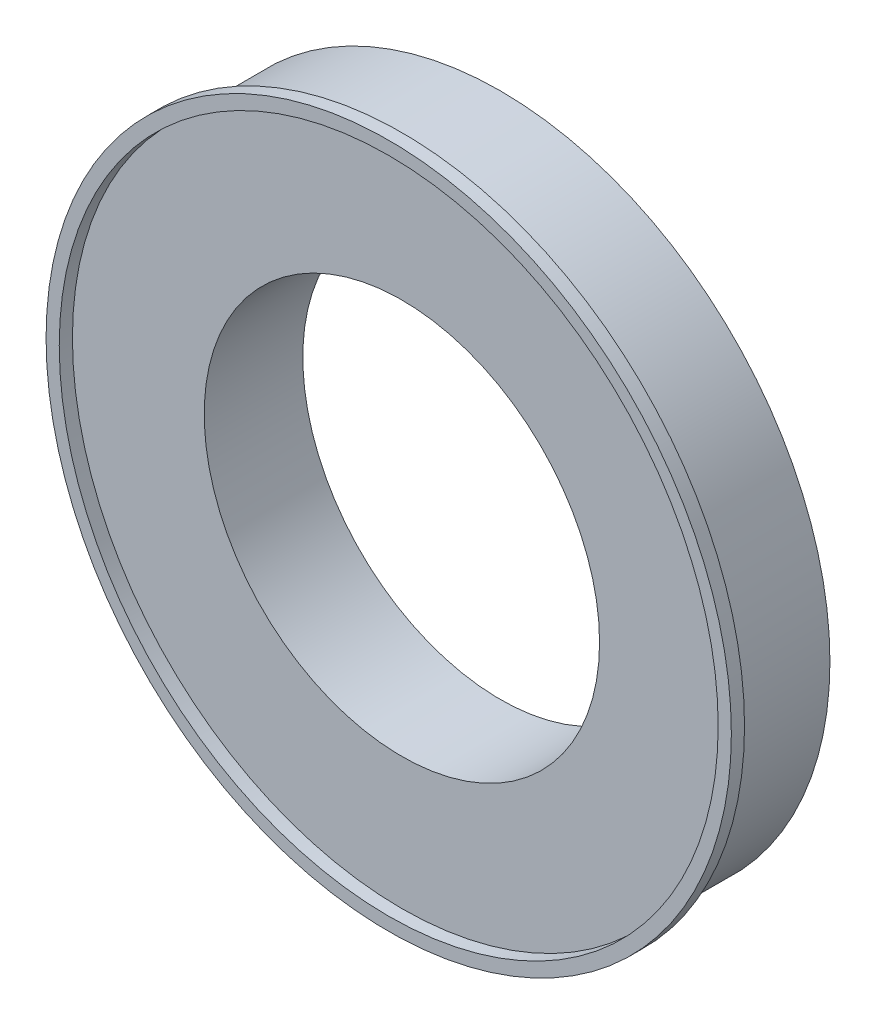
ISO-10303-21;
HEADER;
FILE_DESCRIPTION(('STEP AP214'),'2;1');
FILE_NAME('part.step','',(''),(''),'','','');
FILE_SCHEMA(('AUTOMOTIVE_DESIGN { 1 0 10303 214 1 1 1 1 }'));
ENDSEC;
DATA;
#1=APPLICATION_CONTEXT('core data for automotive mechanical design processes');
#2=APPLICATION_PROTOCOL_DEFINITION('international standard','automotive_design',2000,#1);
#3=PRODUCT_CONTEXT('',#1,'mechanical');
#4=PRODUCT('Part','Part','',(#3));
#5=PRODUCT_RELATED_PRODUCT_CATEGORY('part','',(#4));
#6=PRODUCT_DEFINITION_FORMATION('','',#4);
#7=PRODUCT_DEFINITION_CONTEXT('part definition',#1,'design');
#8=PRODUCT_DEFINITION('design','',#6,#7);
#9=PRODUCT_DEFINITION_SHAPE('','',#8);
#10=(LENGTH_UNIT() NAMED_UNIT(*) SI_UNIT(.MILLI.,.METRE.));
#11=(NAMED_UNIT(*) PLANE_ANGLE_UNIT() SI_UNIT($,.RADIAN.));
#12=(NAMED_UNIT(*) SI_UNIT($,.STERADIAN.) SOLID_ANGLE_UNIT());
#13=UNCERTAINTY_MEASURE_WITH_UNIT(LENGTH_MEASURE(1.E-05),#10,'distance_accuracy_value','');
#14=(GEOMETRIC_REPRESENTATION_CONTEXT(3) GLOBAL_UNCERTAINTY_ASSIGNED_CONTEXT((#13)) GLOBAL_UNIT_ASSIGNED_CONTEXT((#10,
#11,#12)) REPRESENTATION_CONTEXT('',''));
#15=CARTESIAN_POINT('',(0.,0.,0.));
#16=DIRECTION('',(0.,0.,1.));
#17=DIRECTION('',(1.,0.,0.));
#18=AXIS2_PLACEMENT_3D('',#15,#16,#17);
#19=CARTESIAN_POINT('',(0.,0.,12.04));
#20=DIRECTION('',(0.,0.,1.));
#21=DIRECTION('',(1.,0.,0.));
#22=AXIS2_PLACEMENT_3D('',#19,#20,#21);
#23=PLANE('',#22);
#24=CARTESIAN_POINT('',(0.,0.,12.04));
#25=DIRECTION('',(0.,0.,1.));
#26=DIRECTION('',(1.,0.,0.));
#27=AXIS2_PLACEMENT_3D('',#24,#25,#26);
#28=CIRCLE('',#27,66.04);
#29=CARTESIAN_POINT('',(66.04,0.,12.04));
#30=VERTEX_POINT('',#29);
#31=EDGE_CURVE('E11',#30,#30,#28,.T.);
#32=ORIENTED_EDGE('',*,*,#31,.T.);
#33=EDGE_LOOP('',(#32));
#34=FACE_BOUND('',#33,.T.);
#35=CARTESIAN_POINT('',(0.,0.,12.04));
#36=DIRECTION('',(0.,0.,1.));
#37=DIRECTION('',(1.,0.,0.));
#38=AXIS2_PLACEMENT_3D('',#35,#36,#37);
#39=CIRCLE('',#38,63.5);
#40=CARTESIAN_POINT('',(63.5,0.,12.04));
#41=VERTEX_POINT('',#40);
#42=EDGE_CURVE('E51',#41,#41,#39,.T.);
#43=ORIENTED_EDGE('',*,*,#42,.F.);
#44=EDGE_LOOP('',(#43));
#45=FACE_BOUND('',#44,.T.);
#46=ADVANCED_FACE('F40',(#34,#45),#23,.T.);
#47=CARTESIAN_POINT('',(0.,0.,9.5));
#48=DIRECTION('',(0.,0.,1.));
#49=DIRECTION('',(1.,0.,0.));
#50=AXIS2_PLACEMENT_3D('',#47,#48,#49);
#51=PLANE('',#50);
#52=CARTESIAN_POINT('',(0.,0.,9.5));
#53=DIRECTION('',(0.,0.,1.));
#54=DIRECTION('',(1.,0.,0.));
#55=AXIS2_PLACEMENT_3D('',#52,#53,#54);
#56=CIRCLE('',#55,66.04);
#57=CARTESIAN_POINT('',(66.04,0.,9.5));
#58=VERTEX_POINT('',#57);
#59=EDGE_CURVE('E44',#58,#58,#56,.T.);
#60=ORIENTED_EDGE('',*,*,#59,.F.);
#61=EDGE_LOOP('',(#60));
#62=FACE_BOUND('',#61,.T.);
#63=CARTESIAN_POINT('',(0.,0.,9.5));
#64=DIRECTION('',(0.,0.,1.));
#65=DIRECTION('',(1.,0.,0.));
#66=AXIS2_PLACEMENT_3D('',#63,#64,#65);
#67=CIRCLE('',#66,63.5);
#68=CARTESIAN_POINT('',(63.5,0.,9.5));
#69=VERTEX_POINT('',#68);
#70=EDGE_CURVE('E53',#69,#69,#67,.T.);
#71=ORIENTED_EDGE('',*,*,#70,.T.);
#72=EDGE_LOOP('',(#71));
#73=FACE_BOUND('',#72,.T.);
#74=ADVANCED_FACE('F63',(#62,#73),#51,.F.);
#75=CARTESIAN_POINT('',(0.,0.,12.04));
#76=DIRECTION('',(0.,0.,-1.));
#77=DIRECTION('',(-1.,0.,0.));
#78=AXIS2_PLACEMENT_3D('',#75,#76,#77);
#79=CYLINDRICAL_SURFACE('',#78,66.04);
#80=ORIENTED_EDGE('',*,*,#31,.F.);
#81=EDGE_LOOP('',(#80));
#82=FACE_BOUND('',#81,.T.);
#83=ORIENTED_EDGE('',*,*,#59,.T.);
#84=EDGE_LOOP('',(#83));
#85=FACE_BOUND('',#84,.T.);
#86=ADVANCED_FACE('F42',(#82,#85),#79,.T.);
#87=CARTESIAN_POINT('',(0.,0.,12.04));
#88=DIRECTION('',(0.,0.,-1.));
#89=DIRECTION('',(-1.,0.,0.));
#90=AXIS2_PLACEMENT_3D('',#87,#88,#89);
#91=CYLINDRICAL_SURFACE('',#90,63.5);
#92=ORIENTED_EDGE('',*,*,#42,.T.);
#93=EDGE_LOOP('',(#92));
#94=FACE_BOUND('',#93,.T.);
#95=ORIENTED_EDGE('',*,*,#70,.F.);
#96=EDGE_LOOP('',(#95));
#97=FACE_BOUND('',#96,.T.);
#98=ADVANCED_FACE('F59',(#94,#97),#91,.F.);
#99=CLOSED_SHELL('',(#46,#74,#86,#98));
#100=MANIFOLD_SOLID_BREP('B2',#99);
#101=CARTESIAN_POINT('',(0.,0.,9.5));
#102=DIRECTION('',(0.,0.,1.));
#103=DIRECTION('',(1.,0.,0.));
#104=AXIS2_PLACEMENT_3D('',#101,#102,#103);
#105=PLANE('',#104);
#106=CARTESIAN_POINT('',(0.,0.,9.5));
#107=DIRECTION('',(0.,0.,1.));
#108=DIRECTION('',(1.,0.,0.));
#109=AXIS2_PLACEMENT_3D('',#106,#107,#108);
#110=CIRCLE('',#109,63.5);
#111=CARTESIAN_POINT('',(63.5,0.,9.5));
#112=VERTEX_POINT('',#111);
#113=EDGE_CURVE('E39',#112,#112,#110,.T.);
#114=ORIENTED_EDGE('',*,*,#113,.T.);
#115=EDGE_LOOP('',(#114));
#116=FACE_BOUND('',#115,.T.);
#117=CARTESIAN_POINT('',(0.,0.,9.5));
#118=DIRECTION('',(0.,0.,1.));
#119=DIRECTION('',(1.,0.,0.));
#120=AXIS2_PLACEMENT_3D('',#117,#118,#119);
#121=CIRCLE('',#120,38.1);
#122=CARTESIAN_POINT('',(38.1,0.,9.5));
#123=VERTEX_POINT('',#122);
#124=EDGE_CURVE('E112',#123,#123,#121,.T.);
#125=ORIENTED_EDGE('',*,*,#124,.F.);
#126=EDGE_LOOP('',(#125));
#127=FACE_BOUND('',#126,.T.);
#128=ADVANCED_FACE('F101',(#116,#127),#105,.T.);
#129=CARTESIAN_POINT('',(0.,0.,-9.5));
#130=DIRECTION('',(0.,0.,1.));
#131=DIRECTION('',(1.,0.,0.));
#132=AXIS2_PLACEMENT_3D('',#129,#130,#131);
#133=PLANE('',#132);
#134=CARTESIAN_POINT('',(0.,0.,-9.5));
#135=DIRECTION('',(0.,0.,1.));
#136=DIRECTION('',(1.,0.,0.));
#137=AXIS2_PLACEMENT_3D('',#134,#135,#136);
#138=CIRCLE('',#137,63.5);
#139=CARTESIAN_POINT('',(63.5,0.,-9.5));
#140=VERTEX_POINT('',#139);
#141=EDGE_CURVE('E105',#140,#140,#138,.T.);
#142=ORIENTED_EDGE('',*,*,#141,.F.);
#143=EDGE_LOOP('',(#142));
#144=FACE_BOUND('',#143,.T.);
#145=CARTESIAN_POINT('',(0.,0.,-9.5));
#146=DIRECTION('',(0.,0.,1.));
#147=DIRECTION('',(1.,0.,0.));
#148=AXIS2_PLACEMENT_3D('',#145,#146,#147);
#149=CIRCLE('',#148,38.1);
#150=CARTESIAN_POINT('',(38.1,0.,-9.5));
#151=VERTEX_POINT('',#150);
#152=EDGE_CURVE('E114',#151,#151,#149,.T.);
#153=ORIENTED_EDGE('',*,*,#152,.T.);
#154=EDGE_LOOP('',(#153));
#155=FACE_BOUND('',#154,.T.);
#156=ADVANCED_FACE('F124',(#144,#155),#133,.F.);
#157=CARTESIAN_POINT('',(0.,0.,9.5));
#158=DIRECTION('',(0.,0.,-1.));
#159=DIRECTION('',(-1.,0.,0.));
#160=AXIS2_PLACEMENT_3D('',#157,#158,#159);
#161=CYLINDRICAL_SURFACE('',#160,63.5);
#162=ORIENTED_EDGE('',*,*,#113,.F.);
#163=EDGE_LOOP('',(#162));
#164=FACE_BOUND('',#163,.T.);
#165=ORIENTED_EDGE('',*,*,#141,.T.);
#166=EDGE_LOOP('',(#165));
#167=FACE_BOUND('',#166,.T.);
#168=ADVANCED_FACE('F103',(#164,#167),#161,.T.);
#169=CARTESIAN_POINT('',(0.,0.,9.5));
#170=DIRECTION('',(0.,0.,-1.));
#171=DIRECTION('',(-1.,0.,0.));
#172=AXIS2_PLACEMENT_3D('',#169,#170,#171);
#173=CYLINDRICAL_SURFACE('',#172,38.1);
#174=ORIENTED_EDGE('',*,*,#124,.T.);
#175=EDGE_LOOP('',(#174));
#176=FACE_BOUND('',#175,.T.);
#177=ORIENTED_EDGE('',*,*,#152,.F.);
#178=EDGE_LOOP('',(#177));
#179=FACE_BOUND('',#178,.T.);
#180=ADVANCED_FACE('F120',(#176,#179),#173,.F.);
#181=CLOSED_SHELL('',(#128,#156,#168,#180));
#182=MANIFOLD_SOLID_BREP('B6',#181);
#183=ADVANCED_BREP_SHAPE_REPRESENTATION('',(#18,#100,#182),#14);
#184=SHAPE_DEFINITION_REPRESENTATION(#9,#183);
ENDSEC;
END-ISO-10303-21;
